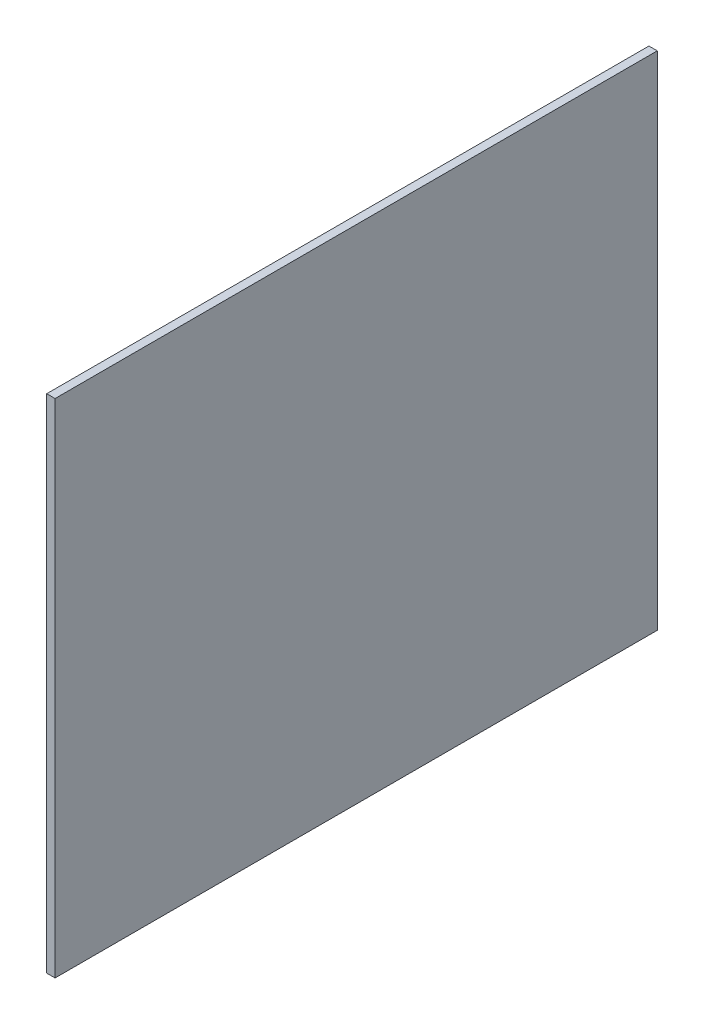
ISO-10303-21;
HEADER;
FILE_DESCRIPTION(('STEP AP214'),'2;1');
FILE_NAME('part.step','',(''),(''),'','','');
FILE_SCHEMA(('AUTOMOTIVE_DESIGN { 1 0 10303 214 1 1 1 1 }'));
ENDSEC;
DATA;
#1=APPLICATION_CONTEXT('core data for automotive mechanical design processes');
#2=APPLICATION_PROTOCOL_DEFINITION('international standard','automotive_design',2000,#1);
#3=PRODUCT_CONTEXT('',#1,'mechanical');
#4=PRODUCT('Part','Part','',(#3));
#5=PRODUCT_RELATED_PRODUCT_CATEGORY('part','',(#4));
#6=PRODUCT_DEFINITION_FORMATION('','',#4);
#7=PRODUCT_DEFINITION_CONTEXT('part definition',#1,'design');
#8=PRODUCT_DEFINITION('design','',#6,#7);
#9=PRODUCT_DEFINITION_SHAPE('','',#8);
#10=(LENGTH_UNIT() NAMED_UNIT(*) SI_UNIT(.MILLI.,.METRE.));
#11=(NAMED_UNIT(*) PLANE_ANGLE_UNIT() SI_UNIT($,.RADIAN.));
#12=(NAMED_UNIT(*) SI_UNIT($,.STERADIAN.) SOLID_ANGLE_UNIT());
#13=UNCERTAINTY_MEASURE_WITH_UNIT(LENGTH_MEASURE(1.E-05),#10,'distance_accuracy_value','');
#14=(GEOMETRIC_REPRESENTATION_CONTEXT(3) GLOBAL_UNCERTAINTY_ASSIGNED_CONTEXT((#13)) GLOBAL_UNIT_ASSIGNED_CONTEXT((#10,
#11,#12)) REPRESENTATION_CONTEXT('',''));
#15=CARTESIAN_POINT('',(0.,0.,0.));
#16=DIRECTION('',(0.,0.,1.));
#17=DIRECTION('',(1.,0.,0.));
#18=AXIS2_PLACEMENT_3D('',#15,#16,#17);
#19=CARTESIAN_POINT('',(5.,150.,180.));
#20=DIRECTION('',(0.,0.,-1.));
#21=DIRECTION('',(0.,1.,0.));
#22=AXIS2_PLACEMENT_3D('',#19,#20,#21);
#23=PLANE('',#22);
#24=DIRECTION('',(0.,-1.,0.));
#25=VECTOR('',#24,1.);
#26=CARTESIAN_POINT('',(0.,150.,180.));
#27=LINE('',#26,#25);
#28=CARTESIAN_POINT('',(0.,150.,180.));
#29=VERTEX_POINT('',#28);
#30=CARTESIAN_POINT('',(0.,-150.,180.));
#31=VERTEX_POINT('',#30);
#32=EDGE_CURVE('E96',#29,#31,#27,.T.);
#33=ORIENTED_EDGE('',*,*,#32,.T.);
#34=DIRECTION('',(-1.,0.,0.));
#35=VECTOR('',#34,1.);
#36=CARTESIAN_POINT('',(5.,-150.,180.));
#37=LINE('',#36,#35);
#38=CARTESIAN_POINT('',(5.,-150.,180.));
#39=VERTEX_POINT('',#38);
#40=EDGE_CURVE('E11',#39,#31,#37,.T.);
#41=ORIENTED_EDGE('',*,*,#40,.F.);
#42=DIRECTION('',(0.,-1.,0.));
#43=VECTOR('',#42,1.);
#44=CARTESIAN_POINT('',(5.,150.,180.));
#45=LINE('',#44,#43);
#46=CARTESIAN_POINT('',(5.,150.,180.));
#47=VERTEX_POINT('',#46);
#48=EDGE_CURVE('E84',#47,#39,#45,.T.);
#49=ORIENTED_EDGE('',*,*,#48,.F.);
#50=DIRECTION('',(-1.,0.,0.));
#51=VECTOR('',#50,1.);
#52=CARTESIAN_POINT('',(5.,150.,180.));
#53=LINE('',#52,#51);
#54=EDGE_CURVE('E92',#47,#29,#53,.T.);
#55=ORIENTED_EDGE('',*,*,#54,.T.);
#56=EDGE_LOOP('',(#33,#41,#49,#55));
#57=FACE_BOUND('',#56,.T.);
#58=ADVANCED_FACE('F33',(#57),#23,.F.);
#59=CARTESIAN_POINT('',(5.,-150.,-180.));
#60=DIRECTION('',(0.,1.,0.));
#61=DIRECTION('',(0.,0.,1.));
#62=AXIS2_PLACEMENT_3D('',#59,#60,#61);
#63=PLANE('',#62);
#64=DIRECTION('',(0.,0.,-1.));
#65=VECTOR('',#64,1.);
#66=CARTESIAN_POINT('',(0.,-150.,-180.));
#67=LINE('',#66,#65);
#68=CARTESIAN_POINT('',(0.,-150.,-180.));
#69=VERTEX_POINT('',#68);
#70=EDGE_CURVE('E88',#31,#69,#67,.T.);
#71=ORIENTED_EDGE('',*,*,#70,.T.);
#72=DIRECTION('',(-1.,0.,0.));
#73=VECTOR('',#72,1.);
#74=CARTESIAN_POINT('',(5.,-150.,-180.));
#75=LINE('',#74,#73);
#76=CARTESIAN_POINT('',(5.,-150.,-180.));
#77=VERTEX_POINT('',#76);
#78=EDGE_CURVE('E41',#77,#69,#75,.T.);
#79=ORIENTED_EDGE('',*,*,#78,.F.);
#80=DIRECTION('',(0.,0.,-1.));
#81=VECTOR('',#80,1.);
#82=CARTESIAN_POINT('',(5.,-150.,-180.));
#83=LINE('',#82,#81);
#84=EDGE_CURVE('E79',#39,#77,#83,.T.);
#85=ORIENTED_EDGE('',*,*,#84,.F.);
#86=ORIENTED_EDGE('',*,*,#40,.T.);
#87=EDGE_LOOP('',(#71,#79,#85,#86));
#88=FACE_BOUND('',#87,.T.);
#89=ADVANCED_FACE('F87',(#88),#63,.F.);
#90=CARTESIAN_POINT('',(5.,150.,-180.));
#91=DIRECTION('',(0.,0.,1.));
#92=DIRECTION('',(1.,0.,0.));
#93=AXIS2_PLACEMENT_3D('',#90,#91,#92);
#94=PLANE('',#93);
#95=DIRECTION('',(0.,1.,0.));
#96=VECTOR('',#95,1.);
#97=CARTESIAN_POINT('',(0.,150.,-180.));
#98=LINE('',#97,#96);
#99=CARTESIAN_POINT('',(0.,150.,-180.));
#100=VERTEX_POINT('',#99);
#101=EDGE_CURVE('E66',#69,#100,#98,.T.);
#102=ORIENTED_EDGE('',*,*,#101,.T.);
#103=DIRECTION('',(-1.,0.,0.));
#104=VECTOR('',#103,1.);
#105=CARTESIAN_POINT('',(5.,150.,-180.));
#106=LINE('',#105,#104);
#107=CARTESIAN_POINT('',(5.,150.,-180.));
#108=VERTEX_POINT('',#107);
#109=EDGE_CURVE('E89',#108,#100,#106,.T.);
#110=ORIENTED_EDGE('',*,*,#109,.F.);
#111=DIRECTION('',(0.,1.,0.));
#112=VECTOR('',#111,1.);
#113=CARTESIAN_POINT('',(5.,150.,-180.));
#114=LINE('',#113,#112);
#115=EDGE_CURVE('E82',#77,#108,#114,.T.);
#116=ORIENTED_EDGE('',*,*,#115,.F.);
#117=ORIENTED_EDGE('',*,*,#78,.T.);
#118=EDGE_LOOP('',(#102,#110,#116,#117));
#119=FACE_BOUND('',#118,.T.);
#120=ADVANCED_FACE('F90',(#119),#94,.F.);
#121=CARTESIAN_POINT('',(5.,150.,-180.));
#122=DIRECTION('',(0.,-1.,0.));
#123=DIRECTION('',(0.,0.,-1.));
#124=AXIS2_PLACEMENT_3D('',#121,#122,#123);
#125=PLANE('',#124);
#126=DIRECTION('',(0.,0.,1.));
#127=VECTOR('',#126,1.);
#128=CARTESIAN_POINT('',(0.,150.,-180.));
#129=LINE('',#128,#127);
#130=EDGE_CURVE('E72',#100,#29,#129,.T.);
#131=ORIENTED_EDGE('',*,*,#130,.T.);
#132=ORIENTED_EDGE('',*,*,#54,.F.);
#133=DIRECTION('',(0.,0.,1.));
#134=VECTOR('',#133,1.);
#135=CARTESIAN_POINT('',(5.,150.,-180.));
#136=LINE('',#135,#134);
#137=EDGE_CURVE('E49',#108,#47,#136,.T.);
#138=ORIENTED_EDGE('',*,*,#137,.F.);
#139=ORIENTED_EDGE('',*,*,#109,.T.);
#140=EDGE_LOOP('',(#131,#132,#138,#139));
#141=FACE_BOUND('',#140,.T.);
#142=ADVANCED_FACE('F103',(#141),#125,.F.);
#143=CARTESIAN_POINT('',(5.,0.,0.));
#144=DIRECTION('',(-1.,0.,0.));
#145=DIRECTION('',(0.,0.,1.));
#146=AXIS2_PLACEMENT_3D('',#143,#144,#145);
#147=PLANE('',#146);
#148=ORIENTED_EDGE('',*,*,#48,.T.);
#149=ORIENTED_EDGE('',*,*,#84,.T.);
#150=ORIENTED_EDGE('',*,*,#115,.T.);
#151=ORIENTED_EDGE('',*,*,#137,.T.);
#152=EDGE_LOOP('',(#148,#149,#150,#151));
#153=FACE_BOUND('',#152,.T.);
#154=ADVANCED_FACE('F80',(#153),#147,.F.);
#155=CARTESIAN_POINT('',(0.,0.,0.));
#156=DIRECTION('',(-1.,0.,0.));
#157=DIRECTION('',(0.,0.,1.));
#158=AXIS2_PLACEMENT_3D('',#155,#156,#157);
#159=PLANE('',#158);
#160=ORIENTED_EDGE('',*,*,#32,.F.);
#161=ORIENTED_EDGE('',*,*,#130,.F.);
#162=ORIENTED_EDGE('',*,*,#101,.F.);
#163=ORIENTED_EDGE('',*,*,#70,.F.);
#164=EDGE_LOOP('',(#160,#161,#162,#163));
#165=FACE_BOUND('',#164,.T.);
#166=ADVANCED_FACE('F106',(#165),#159,.T.);
#167=CLOSED_SHELL('',(#58,#89,#120,#142,#154,#166));
#168=MANIFOLD_SOLID_BREP('B2',#167);
#169=ADVANCED_BREP_SHAPE_REPRESENTATION('',(#18,#168),#14);
#170=SHAPE_DEFINITION_REPRESENTATION(#9,#169);
ENDSEC;
END-ISO-10303-21;
